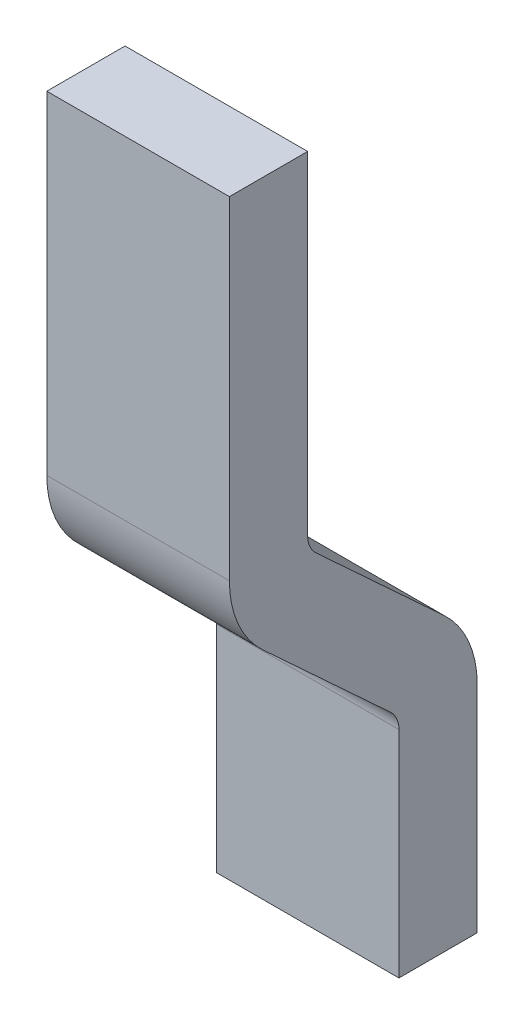
ISO-10303-21;
HEADER;
FILE_DESCRIPTION(('STEP AP214'),'2;1');
FILE_NAME('part.step','',(''),(''),'','','');
FILE_SCHEMA(('AUTOMOTIVE_DESIGN { 1 0 10303 214 1 1 1 1 }'));
ENDSEC;
DATA;
#1=APPLICATION_CONTEXT('core data for automotive mechanical design processes');
#2=APPLICATION_PROTOCOL_DEFINITION('international standard','automotive_design',2000,#1);
#3=PRODUCT_CONTEXT('',#1,'mechanical');
#4=PRODUCT('Part','Part','',(#3));
#5=PRODUCT_RELATED_PRODUCT_CATEGORY('part','',(#4));
#6=PRODUCT_DEFINITION_FORMATION('','',#4);
#7=PRODUCT_DEFINITION_CONTEXT('part definition',#1,'design');
#8=PRODUCT_DEFINITION('design','',#6,#7);
#9=PRODUCT_DEFINITION_SHAPE('','',#8);
#10=(LENGTH_UNIT() NAMED_UNIT(*) SI_UNIT(.MILLI.,.METRE.));
#11=(NAMED_UNIT(*) PLANE_ANGLE_UNIT() SI_UNIT($,.RADIAN.));
#12=(NAMED_UNIT(*) SI_UNIT($,.STERADIAN.) SOLID_ANGLE_UNIT());
#13=UNCERTAINTY_MEASURE_WITH_UNIT(LENGTH_MEASURE(1.E-05),#10,'distance_accuracy_value','');
#14=(GEOMETRIC_REPRESENTATION_CONTEXT(3) GLOBAL_UNCERTAINTY_ASSIGNED_CONTEXT((#13)) GLOBAL_UNIT_ASSIGNED_CONTEXT((#10,
#11,#12)) REPRESENTATION_CONTEXT('',''));
#15=CARTESIAN_POINT('',(0.,0.,0.));
#16=DIRECTION('',(0.,0.,1.));
#17=DIRECTION('',(1.,0.,0.));
#18=AXIS2_PLACEMENT_3D('',#15,#16,#17);
#19=CARTESIAN_POINT('',(0.35,-2.058641392508,0.516801249384));
#20=DIRECTION('',(1.,0.,0.));
#21=DIRECTION('',(0.,1.,0.));
#22=AXIS2_PLACEMENT_3D('',#19,#20,#21);
#23=PLANE('',#22);
#24=DIRECTION('',(0.,1.,0.));
#25=VECTOR('',#24,1.);
#26=CARTESIAN_POINT('',(0.35,-2.5,0.));
#27=LINE('',#26,#25);
#28=CARTESIAN_POINT('',(0.35,-2.675132492706,0.));
#29=VERTEX_POINT('',#28);
#30=CARTESIAN_POINT('',(0.35,-3.5,0.));
#31=VERTEX_POINT('',#30);
#32=EDGE_CURVE('E130',#29,#31,#27,.F.);
#33=ORIENTED_EDGE('',*,*,#32,.F.);
#34=CARTESIAN_POINT('',(0.35,-2.675132492706,0.4));
#35=DIRECTION('',(1.,0.,0.));
#36=DIRECTION('',(0.,1.,0.));
#37=AXIS2_PLACEMENT_3D('',#34,#35,#36);
#38=CIRCLE('',#37,0.4);
#39=CARTESIAN_POINT('',(0.35,-2.38121111485514,0.128687958906932));
#40=VERTEX_POINT('',#39);
#41=EDGE_CURVE('E173',#40,#29,#38,.F.);
#42=ORIENTED_EDGE('',*,*,#41,.F.);
#43=DIRECTION('',(0.,0.678280102733274,0.734803444627296));
#44=VECTOR('',#43,1.);
#45=CARTESIAN_POINT('',(0.35,-1.9,0.65));
#46=LINE('',#45,#44);
#47=CARTESIAN_POINT('',(0.35,-1.92969722128599,0.617828010273283));
#48=VERTEX_POINT('',#47);
#49=EDGE_CURVE('E90',#48,#40,#46,.F.);
#50=ORIENTED_EDGE('',*,*,#49,.F.);
#51=CARTESIAN_POINT('',(0.35,-1.856216876823,0.55));
#52=DIRECTION('',(1.,0.,0.));
#53=DIRECTION('',(0.,1.,0.));
#54=AXIS2_PLACEMENT_3D('',#51,#52,#53);
#55=CIRCLE('',#54,0.1);
#56=CARTESIAN_POINT('',(0.35,-1.856216876823,0.650000000000001));
#57=VERTEX_POINT('',#56);
#58=EDGE_CURVE('E20',#48,#57,#55,.F.);
#59=ORIENTED_EDGE('',*,*,#58,.T.);
#60=DIRECTION('',(0.,1.,0.));
#61=VECTOR('',#60,1.);
#62=CARTESIAN_POINT('',(0.35,-0.580679000001,0.65));
#63=LINE('',#62,#61);
#64=CARTESIAN_POINT('',(0.35,-0.580679000001,0.65));
#65=VERTEX_POINT('',#64);
#66=EDGE_CURVE('E96',#65,#57,#63,.F.);
#67=ORIENTED_EDGE('',*,*,#66,.F.);
#68=DIRECTION('',(0.,0.,1.));
#69=VECTOR('',#68,1.);
#70=CARTESIAN_POINT('',(0.35,-0.580679000001,0.95));
#71=LINE('',#70,#69);
#72=CARTESIAN_POINT('',(0.35,-0.580679000001,0.95));
#73=VERTEX_POINT('',#72);
#74=EDGE_CURVE('E102',#73,#65,#71,.F.);
#75=ORIENTED_EDGE('',*,*,#74,.F.);
#76=DIRECTION('',(0.,-1.,0.));
#77=VECTOR('',#76,1.);
#78=CARTESIAN_POINT('',(0.35,-2.03134936953,0.95));
#79=LINE('',#78,#77);
#80=CARTESIAN_POINT('',(0.35,-1.856216876823,0.95));
#81=VERTEX_POINT('',#80);
#82=EDGE_CURVE('E108',#81,#73,#79,.F.);
#83=ORIENTED_EDGE('',*,*,#82,.F.);
#84=CARTESIAN_POINT('',(0.35,-1.856216876823,0.55));
#85=DIRECTION('',(1.,0.,0.));
#86=DIRECTION('',(0.,1.,0.));
#87=AXIS2_PLACEMENT_3D('',#84,#85,#86);
#88=CIRCLE('',#87,0.4);
#89=CARTESIAN_POINT('',(0.35,-2.15013825467426,0.821312041093428));
#90=VERTEX_POINT('',#89);
#91=EDGE_CURVE('E196',#90,#81,#88,.F.);
#92=ORIENTED_EDGE('',*,*,#91,.F.);
#93=DIRECTION('',(0.,-0.678280102733274,-0.734803444627296));
#94=VECTOR('',#93,1.);
#95=CARTESIAN_POINT('',(0.35,-2.63134936953,0.3));
#96=LINE('',#95,#94);
#97=CARTESIAN_POINT('',(0.35,-2.60165214824351,0.332171989726717));
#98=VERTEX_POINT('',#97);
#99=EDGE_CURVE('E193',#98,#90,#96,.F.);
#100=ORIENTED_EDGE('',*,*,#99,.F.);
#101=CARTESIAN_POINT('',(0.35,-2.675132492706,0.4));
#102=DIRECTION('',(1.,0.,0.));
#103=DIRECTION('',(0.,1.,0.));
#104=AXIS2_PLACEMENT_3D('',#101,#102,#103);
#105=CIRCLE('',#104,0.1);
#106=CARTESIAN_POINT('',(0.35,-2.675132492706,0.3));
#107=VERTEX_POINT('',#106);
#108=EDGE_CURVE('E190',#98,#107,#105,.F.);
#109=ORIENTED_EDGE('',*,*,#108,.T.);
#110=DIRECTION('',(0.,-1.,0.));
#111=VECTOR('',#110,1.);
#112=CARTESIAN_POINT('',(0.35,-3.5,0.3));
#113=LINE('',#112,#111);
#114=CARTESIAN_POINT('',(0.35,-3.5,0.3));
#115=VERTEX_POINT('',#114);
#116=EDGE_CURVE('E186',#115,#107,#113,.F.);
#117=ORIENTED_EDGE('',*,*,#116,.F.);
#118=DIRECTION('',(0.,0.,1.));
#119=VECTOR('',#118,1.);
#120=CARTESIAN_POINT('',(0.35,-3.5,0.));
#121=LINE('',#120,#119);
#122=EDGE_CURVE('E126',#31,#115,#121,.T.);
#123=ORIENTED_EDGE('',*,*,#122,.F.);
#124=EDGE_LOOP('',(#33,#42,#50,#59,#67,#75,#83,#92,#100,#109,#117,#123));
#125=FACE_BOUND('',#124,.T.);
#126=ADVANCED_FACE('F17',(#125),#23,.T.);
#127=CARTESIAN_POINT('',(-0.35,-1.9,0.65));
#128=DIRECTION('',(0.,0.734803444627296,-0.678280102733274));
#129=DIRECTION('',(0.,0.678280102733274,0.734803444627296));
#130=AXIS2_PLACEMENT_3D('',#127,#128,#129);
#131=PLANE('',#130);
#132=ORIENTED_EDGE('',*,*,#49,.T.);
#133=DIRECTION('',(1.,0.,0.));
#134=VECTOR('',#133,1.);
#135=CARTESIAN_POINT('',(-0.35,-2.38121111485489,0.128687958906898));
#136=LINE('',#135,#134);
#137=CARTESIAN_POINT('',(-0.35,-2.38121111485506,0.128687958906824));
#138=VERTEX_POINT('',#137);
#139=EDGE_CURVE('E174',#138,#40,#136,.T.);
#140=ORIENTED_EDGE('',*,*,#139,.F.);
#141=DIRECTION('',(0.,0.678280102733378,0.7348034446272));
#142=VECTOR('',#141,1.);
#143=CARTESIAN_POINT('',(-0.35,-2.381211114855,0.128687958907));
#144=LINE('',#143,#142);
#145=CARTESIAN_POINT('',(-0.35,-1.92969722128586,0.617828010273169));
#146=VERTEX_POINT('',#145);
#147=EDGE_CURVE('E169',#138,#146,#144,.T.);
#148=ORIENTED_EDGE('',*,*,#147,.T.);
#149=DIRECTION('',(1.,0.,0.));
#150=VECTOR('',#149,1.);
#151=CARTESIAN_POINT('',(-0.35,-1.92969722128602,0.617828010273016));
#152=LINE('',#151,#150);
#153=EDGE_CURVE('E211',#146,#48,#152,.T.);
#154=ORIENTED_EDGE('',*,*,#153,.T.);
#155=EDGE_LOOP('',(#132,#140,#148,#154));
#156=FACE_BOUND('',#155,.T.);
#157=ADVANCED_FACE('F258',(#156),#131,.T.);
#158=CARTESIAN_POINT('',(-0.35,-1.856216876823,0.55));
#159=DIRECTION('',(1.,0.,0.));
#160=DIRECTION('',(0.,1.,0.));
#161=AXIS2_PLACEMENT_3D('',#158,#159,#160);
#162=CYLINDRICAL_SURFACE('',#161,0.1);
#163=ORIENTED_EDGE('',*,*,#58,.F.);
#164=ORIENTED_EDGE('',*,*,#153,.F.);
#165=CARTESIAN_POINT('',(-0.35,-1.856216876823,0.55));
#166=DIRECTION('',(1.,0.,0.));
#167=DIRECTION('',(0.,1.,0.));
#168=AXIS2_PLACEMENT_3D('',#165,#166,#167);
#169=CIRCLE('',#168,0.1);
#170=CARTESIAN_POINT('',(-0.35,-1.856216876823,0.65));
#171=VERTEX_POINT('',#170);
#172=EDGE_CURVE('E166',#146,#171,#169,.F.);
#173=ORIENTED_EDGE('',*,*,#172,.T.);
#174=DIRECTION('',(1.,0.,0.));
#175=VECTOR('',#174,1.);
#176=CARTESIAN_POINT('',(-0.35,-1.856216876823,0.65));
#177=LINE('',#176,#175);
#178=EDGE_CURVE('E209',#57,#171,#177,.F.);
#179=ORIENTED_EDGE('',*,*,#178,.F.);
#180=EDGE_LOOP('',(#163,#164,#173,#179));
#181=FACE_BOUND('',#180,.T.);
#182=ADVANCED_FACE('F256',(#181),#162,.F.);
#183=CARTESIAN_POINT('',(-0.35,-0.580679000001,0.65));
#184=DIRECTION('',(0.,0.,-1.));
#185=DIRECTION('',(0.,1.,0.));
#186=AXIS2_PLACEMENT_3D('',#183,#184,#185);
#187=PLANE('',#186);
#188=ORIENTED_EDGE('',*,*,#66,.T.);
#189=ORIENTED_EDGE('',*,*,#178,.T.);
#190=DIRECTION('',(0.,1.,0.));
#191=VECTOR('',#190,1.);
#192=CARTESIAN_POINT('',(-0.35,-2.058641392508,0.65));
#193=LINE('',#192,#191);
#194=CARTESIAN_POINT('',(-0.35,-0.580679000001,0.65));
#195=VERTEX_POINT('',#194);
#196=EDGE_CURVE('E163',#171,#195,#193,.T.);
#197=ORIENTED_EDGE('',*,*,#196,.T.);
#198=DIRECTION('',(-1.,0.,0.));
#199=VECTOR('',#198,1.);
#200=CARTESIAN_POINT('',(-0.35,-0.580679000001,0.65));
#201=LINE('',#200,#199);
#202=EDGE_CURVE('E205',#65,#195,#201,.T.);
#203=ORIENTED_EDGE('',*,*,#202,.F.);
#204=EDGE_LOOP('',(#188,#189,#197,#203));
#205=FACE_BOUND('',#204,.T.);
#206=ADVANCED_FACE('F252',(#205),#187,.T.);
#207=CARTESIAN_POINT('',(-0.35,-0.580679000001,0.95));
#208=DIRECTION('',(0.,1.,0.));
#209=DIRECTION('',(-1.,0.,0.));
#210=AXIS2_PLACEMENT_3D('',#207,#208,#209);
#211=PLANE('',#210);
#212=ORIENTED_EDGE('',*,*,#202,.T.);
#213=DIRECTION('',(0.,0.,1.));
#214=VECTOR('',#213,1.);
#215=CARTESIAN_POINT('',(-0.35,-0.580679000001,0.516801249384));
#216=LINE('',#215,#214);
#217=CARTESIAN_POINT('',(-0.35,-0.580679000001,0.95));
#218=VERTEX_POINT('',#217);
#219=EDGE_CURVE('E160',#195,#218,#216,.T.);
#220=ORIENTED_EDGE('',*,*,#219,.T.);
#221=DIRECTION('',(1.,0.,0.));
#222=VECTOR('',#221,1.);
#223=CARTESIAN_POINT('',(-0.35,-0.580679000001,0.95));
#224=LINE('',#223,#222);
#225=EDGE_CURVE('E197',#73,#218,#224,.F.);
#226=ORIENTED_EDGE('',*,*,#225,.F.);
#227=ORIENTED_EDGE('',*,*,#74,.T.);
#228=EDGE_LOOP('',(#212,#220,#226,#227));
#229=FACE_BOUND('',#228,.T.);
#230=ADVANCED_FACE('F251',(#229),#211,.T.);
#231=CARTESIAN_POINT('',(-0.35,-2.03134936953,0.95));
#232=DIRECTION('',(0.,0.,1.));
#233=DIRECTION('',(0.,-1.,0.));
#234=AXIS2_PLACEMENT_3D('',#231,#232,#233);
#235=PLANE('',#234);
#236=ORIENTED_EDGE('',*,*,#82,.T.);
#237=ORIENTED_EDGE('',*,*,#225,.T.);
#238=DIRECTION('',(0.,1.,0.));
#239=VECTOR('',#238,1.);
#240=CARTESIAN_POINT('',(-0.35,-2.058641392508,0.95));
#241=LINE('',#240,#239);
#242=CARTESIAN_POINT('',(-0.35,-1.856216876823,0.95));
#243=VERTEX_POINT('',#242);
#244=EDGE_CURVE('E157',#218,#243,#241,.F.);
#245=ORIENTED_EDGE('',*,*,#244,.T.);
#246=DIRECTION('',(1.,0.,0.));
#247=VECTOR('',#246,1.);
#248=CARTESIAN_POINT('',(-0.35,-1.856216876823,0.95));
#249=LINE('',#248,#247);
#250=EDGE_CURVE('E194',#81,#243,#249,.F.);
#251=ORIENTED_EDGE('',*,*,#250,.F.);
#252=EDGE_LOOP('',(#236,#237,#245,#251));
#253=FACE_BOUND('',#252,.T.);
#254=ADVANCED_FACE('F246',(#253),#235,.T.);
#255=CARTESIAN_POINT('',(-0.35,-1.856216876823,0.55));
#256=DIRECTION('',(1.,0.,0.));
#257=DIRECTION('',(0.,1.,0.));
#258=AXIS2_PLACEMENT_3D('',#255,#256,#257);
#259=CYLINDRICAL_SURFACE('',#258,0.4);
#260=ORIENTED_EDGE('',*,*,#91,.T.);
#261=ORIENTED_EDGE('',*,*,#250,.T.);
#262=CARTESIAN_POINT('',(-0.35,-1.856216876823,0.55));
#263=DIRECTION('',(1.,0.,0.));
#264=DIRECTION('',(0.,1.,0.));
#265=AXIS2_PLACEMENT_3D('',#262,#263,#264);
#266=CIRCLE('',#265,0.4);
#267=CARTESIAN_POINT('',(-0.35,-2.15013825467391,0.821312041093449));
#268=VERTEX_POINT('',#267);
#269=EDGE_CURVE('E156',#243,#268,#266,.T.);
#270=ORIENTED_EDGE('',*,*,#269,.T.);
#271=DIRECTION('',(1.,0.,0.));
#272=VECTOR('',#271,1.);
#273=CARTESIAN_POINT('',(-0.35,-2.15013825467435,0.821312041093324));
#274=LINE('',#273,#272);
#275=EDGE_CURVE('E191',#90,#268,#274,.F.);
#276=ORIENTED_EDGE('',*,*,#275,.F.);
#277=EDGE_LOOP('',(#260,#261,#270,#276));
#278=FACE_BOUND('',#277,.T.);
#279=ADVANCED_FACE('F243',(#278),#259,.T.);
#280=CARTESIAN_POINT('',(-0.35,-2.63134936953,0.3));
#281=DIRECTION('',(0.,-0.734803444627296,0.678280102733274));
#282=DIRECTION('',(0.,-0.678280102733274,-0.734803444627296));
#283=AXIS2_PLACEMENT_3D('',#280,#281,#282);
#284=PLANE('',#283);
#285=ORIENTED_EDGE('',*,*,#99,.T.);
#286=ORIENTED_EDGE('',*,*,#275,.T.);
#287=DIRECTION('',(0.,-0.678280102734188,-0.734803444626452));
#288=VECTOR('',#287,1.);
#289=CARTESIAN_POINT('',(-0.35,-2.150138254674,0.821312041093));
#290=LINE('',#289,#288);
#291=CARTESIAN_POINT('',(-0.35,-2.60165214824368,0.332171989726791));
#292=VERTEX_POINT('',#291);
#293=EDGE_CURVE('E146',#268,#292,#290,.T.);
#294=ORIENTED_EDGE('',*,*,#293,.T.);
#295=DIRECTION('',(1.,0.,0.));
#296=VECTOR('',#295,1.);
#297=CARTESIAN_POINT('',(-0.35,-2.60165214824344,0.332171989726486));
#298=LINE('',#297,#296);
#299=EDGE_CURVE('E187',#292,#98,#298,.T.);
#300=ORIENTED_EDGE('',*,*,#299,.T.);
#301=EDGE_LOOP('',(#285,#286,#294,#300));
#302=FACE_BOUND('',#301,.T.);
#303=ADVANCED_FACE('F266',(#302),#284,.T.);
#304=CARTESIAN_POINT('',(-0.35,-2.675132492706,0.4));
#305=DIRECTION('',(1.,0.,0.));
#306=DIRECTION('',(0.,1.,0.));
#307=AXIS2_PLACEMENT_3D('',#304,#305,#306);
#308=CYLINDRICAL_SURFACE('',#307,0.1);
#309=ORIENTED_EDGE('',*,*,#108,.F.);
#310=ORIENTED_EDGE('',*,*,#299,.F.);
#311=CARTESIAN_POINT('',(-0.35,-2.675132492706,0.4));
#312=DIRECTION('',(1.,0.,0.));
#313=DIRECTION('',(0.,1.,0.));
#314=AXIS2_PLACEMENT_3D('',#311,#312,#313);
#315=CIRCLE('',#314,0.1);
#316=CARTESIAN_POINT('',(-0.35,-2.675132492706,0.3));
#317=VERTEX_POINT('',#316);
#318=EDGE_CURVE('E144',#292,#317,#315,.F.);
#319=ORIENTED_EDGE('',*,*,#318,.T.);
#320=DIRECTION('',(1.,0.,0.));
#321=VECTOR('',#320,1.);
#322=CARTESIAN_POINT('',(-0.35,-2.675132492706,0.3));
#323=LINE('',#322,#321);
#324=EDGE_CURVE('E143',#107,#317,#323,.F.);
#325=ORIENTED_EDGE('',*,*,#324,.F.);
#326=EDGE_LOOP('',(#309,#310,#319,#325));
#327=FACE_BOUND('',#326,.T.);
#328=ADVANCED_FACE('F264',(#327),#308,.F.);
#329=CARTESIAN_POINT('',(-0.35,-3.5,0.3));
#330=DIRECTION('',(0.,0.,1.));
#331=DIRECTION('',(0.,-1.,0.));
#332=AXIS2_PLACEMENT_3D('',#329,#330,#331);
#333=PLANE('',#332);
#334=ORIENTED_EDGE('',*,*,#116,.T.);
#335=ORIENTED_EDGE('',*,*,#324,.T.);
#336=DIRECTION('',(0.,1.,0.));
#337=VECTOR('',#336,1.);
#338=CARTESIAN_POINT('',(-0.35,-2.058641392508,0.3));
#339=LINE('',#338,#337);
#340=CARTESIAN_POINT('',(-0.35,-3.5,0.3));
#341=VERTEX_POINT('',#340);
#342=EDGE_CURVE('E137',#317,#341,#339,.F.);
#343=ORIENTED_EDGE('',*,*,#342,.T.);
#344=DIRECTION('',(1.,0.,0.));
#345=VECTOR('',#344,1.);
#346=CARTESIAN_POINT('',(-0.35,-3.5,0.3));
#347=LINE('',#346,#345);
#348=EDGE_CURVE('E120',#115,#341,#347,.F.);
#349=ORIENTED_EDGE('',*,*,#348,.F.);
#350=EDGE_LOOP('',(#334,#335,#343,#349));
#351=FACE_BOUND('',#350,.T.);
#352=ADVANCED_FACE('F141',(#351),#333,.T.);
#353=CARTESIAN_POINT('',(-0.35,-3.5,0.));
#354=DIRECTION('',(0.,-1.,0.));
#355=DIRECTION('',(1.,0.,0.));
#356=AXIS2_PLACEMENT_3D('',#353,#354,#355);
#357=PLANE('',#356);
#358=ORIENTED_EDGE('',*,*,#348,.T.);
#359=DIRECTION('',(0.,0.,1.));
#360=VECTOR('',#359,1.);
#361=CARTESIAN_POINT('',(-0.35,-3.5,0.516801249384));
#362=LINE('',#361,#360);
#363=CARTESIAN_POINT('',(-0.35,-3.5,0.));
#364=VERTEX_POINT('',#363);
#365=EDGE_CURVE('E124',#341,#364,#362,.F.);
#366=ORIENTED_EDGE('',*,*,#365,.T.);
#367=DIRECTION('',(1.,0.,0.));
#368=VECTOR('',#367,1.);
#369=CARTESIAN_POINT('',(-0.35,-3.5,0.));
#370=LINE('',#369,#368);
#371=EDGE_CURVE('E177',#31,#364,#370,.F.);
#372=ORIENTED_EDGE('',*,*,#371,.F.);
#373=ORIENTED_EDGE('',*,*,#122,.T.);
#374=EDGE_LOOP('',(#358,#366,#372,#373));
#375=FACE_BOUND('',#374,.T.);
#376=ADVANCED_FACE('F122',(#375),#357,.T.);
#377=CARTESIAN_POINT('',(-0.35,-2.5,0.));
#378=DIRECTION('',(0.,0.,-1.));
#379=DIRECTION('',(0.,1.,0.));
#380=AXIS2_PLACEMENT_3D('',#377,#378,#379);
#381=PLANE('',#380);
#382=ORIENTED_EDGE('',*,*,#32,.T.);
#383=ORIENTED_EDGE('',*,*,#371,.T.);
#384=DIRECTION('',(0.,1.,0.));
#385=VECTOR('',#384,1.);
#386=CARTESIAN_POINT('',(-0.35,-2.058641392508,0.));
#387=LINE('',#386,#385);
#388=CARTESIAN_POINT('',(-0.35,-2.675132492706,0.));
#389=VERTEX_POINT('',#388);
#390=EDGE_CURVE('E26',#364,#389,#387,.T.);
#391=ORIENTED_EDGE('',*,*,#390,.T.);
#392=DIRECTION('',(1.,0.,0.));
#393=VECTOR('',#392,1.);
#394=CARTESIAN_POINT('',(-0.35,-2.675132492706,0.));
#395=LINE('',#394,#393);
#396=EDGE_CURVE('E34',#29,#389,#395,.F.);
#397=ORIENTED_EDGE('',*,*,#396,.F.);
#398=EDGE_LOOP('',(#382,#383,#391,#397));
#399=FACE_BOUND('',#398,.T.);
#400=ADVANCED_FACE('F261',(#399),#381,.T.);
#401=CARTESIAN_POINT('',(-0.35,-2.675132492706,0.4));
#402=DIRECTION('',(1.,0.,0.));
#403=DIRECTION('',(0.,1.,0.));
#404=AXIS2_PLACEMENT_3D('',#401,#402,#403);
#405=CYLINDRICAL_SURFACE('',#404,0.4);
#406=ORIENTED_EDGE('',*,*,#396,.T.);
#407=CARTESIAN_POINT('',(-0.35,-2.675132492706,0.4));
#408=DIRECTION('',(1.,0.,0.));
#409=DIRECTION('',(0.,1.,0.));
#410=AXIS2_PLACEMENT_3D('',#407,#408,#409);
#411=CIRCLE('',#410,0.4);
#412=EDGE_CURVE('E11',#389,#138,#411,.T.);
#413=ORIENTED_EDGE('',*,*,#412,.T.);
#414=ORIENTED_EDGE('',*,*,#139,.T.);
#415=ORIENTED_EDGE('',*,*,#41,.T.);
#416=EDGE_LOOP('',(#406,#413,#414,#415));
#417=FACE_BOUND('',#416,.T.);
#418=ADVANCED_FACE('F277',(#417),#405,.T.);
#419=CARTESIAN_POINT('',(-0.35,-2.058641392508,0.516801249384));
#420=DIRECTION('',(1.,0.,0.));
#421=DIRECTION('',(0.,1.,0.));
#422=AXIS2_PLACEMENT_3D('',#419,#420,#421);
#423=PLANE('',#422);
#424=ORIENTED_EDGE('',*,*,#390,.F.);
#425=ORIENTED_EDGE('',*,*,#365,.F.);
#426=ORIENTED_EDGE('',*,*,#342,.F.);
#427=ORIENTED_EDGE('',*,*,#318,.F.);
#428=ORIENTED_EDGE('',*,*,#293,.F.);
#429=ORIENTED_EDGE('',*,*,#269,.F.);
#430=ORIENTED_EDGE('',*,*,#244,.F.);
#431=ORIENTED_EDGE('',*,*,#219,.F.);
#432=ORIENTED_EDGE('',*,*,#196,.F.);
#433=ORIENTED_EDGE('',*,*,#172,.F.);
#434=ORIENTED_EDGE('',*,*,#147,.F.);
#435=ORIENTED_EDGE('',*,*,#412,.F.);
#436=EDGE_LOOP('',(#424,#425,#426,#427,#428,#429,#430,#431,#432,#433,#434,#435));
#437=FACE_BOUND('',#436,.T.);
#438=ADVANCED_FACE('F135',(#437),#423,.F.);
#439=CLOSED_SHELL('',(#126,#157,#182,#206,#230,#254,#279,#303,#328,#352,#376,#400,#418,#438));
#440=MANIFOLD_SOLID_BREP('B1',#439);
#441=ADVANCED_BREP_SHAPE_REPRESENTATION('',(#18,#440),#14);
#442=SHAPE_DEFINITION_REPRESENTATION(#9,#441);
ENDSEC;
END-ISO-10303-21;
